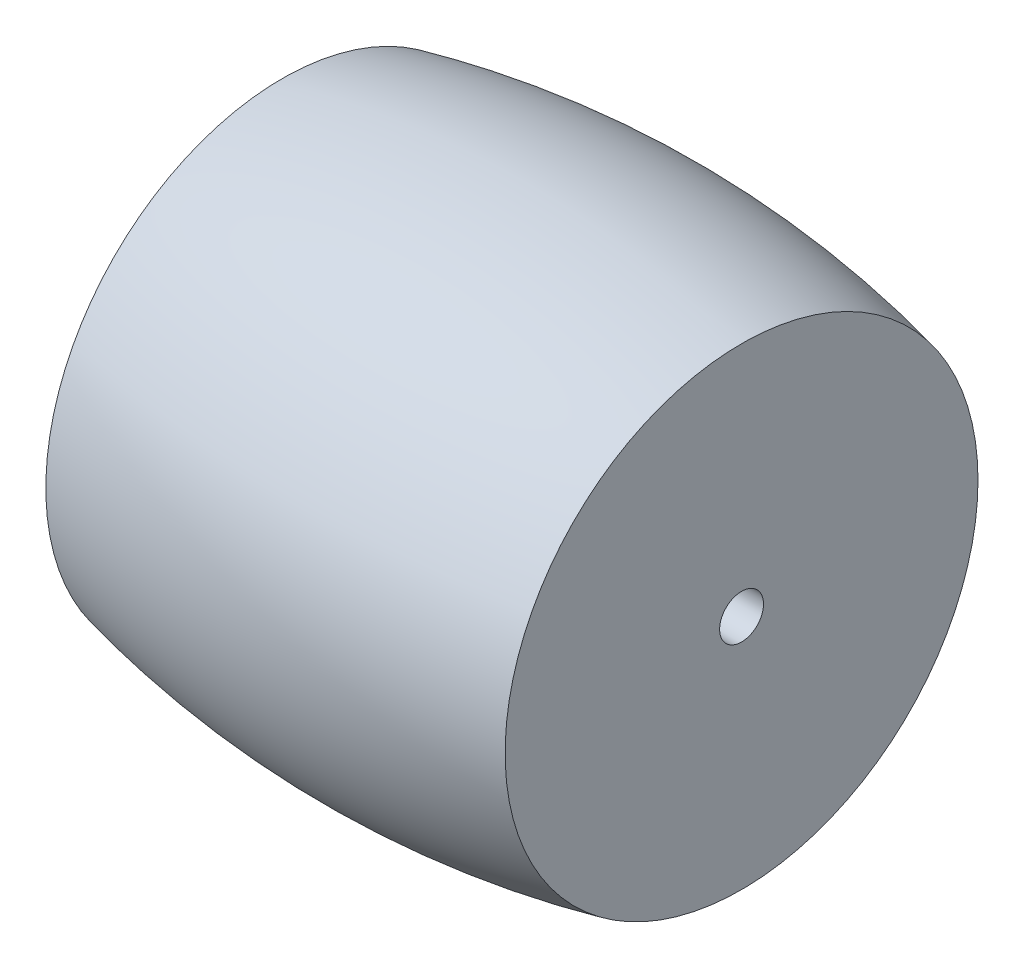
ISO-10303-21;
HEADER;
FILE_DESCRIPTION(('STEP AP214'),'2;1');
FILE_NAME('part.step','',(''),(''),'','','');
FILE_SCHEMA(('AUTOMOTIVE_DESIGN { 1 0 10303 214 1 1 1 1 }'));
ENDSEC;
DATA;
#1=APPLICATION_CONTEXT('core data for automotive mechanical design processes');
#2=APPLICATION_PROTOCOL_DEFINITION('international standard','automotive_design',2000,#1);
#3=PRODUCT_CONTEXT('',#1,'mechanical');
#4=PRODUCT('Part','Part','',(#3));
#5=PRODUCT_RELATED_PRODUCT_CATEGORY('part','',(#4));
#6=PRODUCT_DEFINITION_FORMATION('','',#4);
#7=PRODUCT_DEFINITION_CONTEXT('part definition',#1,'design');
#8=PRODUCT_DEFINITION('design','',#6,#7);
#9=PRODUCT_DEFINITION_SHAPE('','',#8);
#10=(LENGTH_UNIT() NAMED_UNIT(*) SI_UNIT(.MILLI.,.METRE.));
#11=(NAMED_UNIT(*) PLANE_ANGLE_UNIT() SI_UNIT($,.RADIAN.));
#12=(NAMED_UNIT(*) SI_UNIT($,.STERADIAN.) SOLID_ANGLE_UNIT());
#13=UNCERTAINTY_MEASURE_WITH_UNIT(LENGTH_MEASURE(1.E-05),#10,'distance_accuracy_value','');
#14=(GEOMETRIC_REPRESENTATION_CONTEXT(3) GLOBAL_UNCERTAINTY_ASSIGNED_CONTEXT((#13)) GLOBAL_UNIT_ASSIGNED_CONTEXT((#10,
#11,#12)) REPRESENTATION_CONTEXT('',''));
#15=CARTESIAN_POINT('',(0.,0.,0.));
#16=DIRECTION('',(0.,0.,1.));
#17=DIRECTION('',(1.,0.,0.));
#18=AXIS2_PLACEMENT_3D('',#15,#16,#17);
#19=CARTESIAN_POINT('',(-14.6474404776742,1.39999999999999,0.));
#20=DIRECTION('',(-1.,0.,0.));
#21=DIRECTION('',(0.,0.,1.));
#22=AXIS2_PLACEMENT_3D('',#19,#20,#21);
#23=PLANE('',#22);
#24=CARTESIAN_POINT('',(-14.6474404776742,0.,0.));
#25=DIRECTION('',(1.,0.,0.));
#26=DIRECTION('',(0.,0.,-1.));
#27=AXIS2_PLACEMENT_3D('',#24,#25,#26);
#28=CIRCLE('',#27,15.08125);
#29=CARTESIAN_POINT('',(-14.6474404776742,0.,-15.08125));
#30=VERTEX_POINT('',#29);
#31=EDGE_CURVE('E73',#30,#30,#28,.T.);
#32=ORIENTED_EDGE('',*,*,#31,.F.);
#33=EDGE_LOOP('',(#32));
#34=FACE_BOUND('',#33,.T.);
#35=CARTESIAN_POINT('',(-14.6474404776742,0.,0.));
#36=DIRECTION('',(1.,0.,0.));
#37=DIRECTION('',(0.,0.,-1.));
#38=AXIS2_PLACEMENT_3D('',#35,#36,#37);
#39=CIRCLE('',#38,1.39999999999999);
#40=CARTESIAN_POINT('',(-14.6474404776742,0.,-1.39999999999999));
#41=VERTEX_POINT('',#40);
#42=EDGE_CURVE('E71',#41,#41,#39,.T.);
#43=ORIENTED_EDGE('',*,*,#42,.T.);
#44=EDGE_LOOP('',(#43));
#45=FACE_BOUND('',#44,.T.);
#46=ADVANCED_FACE('F36',(#34,#45),#23,.T.);
#47=CARTESIAN_POINT('',(23.6421256724856,0.,0.));
#48=DIRECTION('',(1.,0.,0.));
#49=DIRECTION('',(0.,0.,-1.));
#50=AXIS2_PLACEMENT_3D('',#47,#48,#49);
#51=CYLINDRICAL_SURFACE('',#50,1.39999999999999);
#52=CARTESIAN_POINT('',(14.6474404776742,0.,0.));
#53=DIRECTION('',(1.,0.,0.));
#54=DIRECTION('',(0.,0.,-1.));
#55=AXIS2_PLACEMENT_3D('',#52,#53,#54);
#56=CIRCLE('',#55,1.39999999999999);
#57=CARTESIAN_POINT('',(14.6474404776742,0.,-1.39999999999999));
#58=VERTEX_POINT('',#57);
#59=EDGE_CURVE('E68',#58,#58,#56,.T.);
#60=ORIENTED_EDGE('',*,*,#59,.T.);
#61=EDGE_LOOP('',(#60));
#62=FACE_BOUND('',#61,.T.);
#63=ORIENTED_EDGE('',*,*,#42,.F.);
#64=EDGE_LOOP('',(#63));
#65=FACE_BOUND('',#64,.T.);
#66=ADVANCED_FACE('F142',(#62,#65),#51,.F.);
#67=CARTESIAN_POINT('',(14.6474404776742,1.39999999999999,0.));
#68=DIRECTION('',(1.,0.,0.));
#69=DIRECTION('',(0.,0.,-1.));
#70=AXIS2_PLACEMENT_3D('',#67,#68,#69);
#71=PLANE('',#70);
#72=CARTESIAN_POINT('',(14.6474404776742,0.,0.));
#73=DIRECTION('',(1.,0.,0.));
#74=DIRECTION('',(0.,0.,-1.));
#75=AXIS2_PLACEMENT_3D('',#72,#73,#74);
#76=CIRCLE('',#75,15.08125);
#77=CARTESIAN_POINT('',(14.6474404776742,0.,-15.08125));
#78=VERTEX_POINT('',#77);
#79=EDGE_CURVE('E65',#78,#78,#76,.T.);
#80=ORIENTED_EDGE('',*,*,#79,.T.);
#81=EDGE_LOOP('',(#80));
#82=FACE_BOUND('',#81,.T.);
#83=ORIENTED_EDGE('',*,*,#59,.F.);
#84=EDGE_LOOP('',(#83));
#85=FACE_BOUND('',#84,.T.);
#86=ADVANCED_FACE('F149',(#82,#85),#71,.T.);
#87=CARTESIAN_POINT('',(0.,0.,0.));
#88=DIRECTION('',(1.,0.,0.));
#89=DIRECTION('',(0.,0.,-1.));
#90=AXIS2_PLACEMENT_3D('',#87,#88,#89);
#91=DEGENERATE_TOROIDAL_SURFACE('',#90,49.0933798193686,65.825,.F.);
#92=ORIENTED_EDGE('',*,*,#31,.T.);
#93=EDGE_LOOP('',(#92));
#94=FACE_BOUND('',#93,.T.);
#95=ORIENTED_EDGE('',*,*,#79,.F.);
#96=EDGE_LOOP('',(#95));
#97=FACE_BOUND('',#96,.T.);
#98=ADVANCED_FACE('F154',(#94,#97),#91,.F.);
#99=CLOSED_SHELL('',(#46,#66,#86,#98));
#100=CARTESIAN_POINT('',(0.,0.,0.));
#101=DIRECTION('',(1.,0.,0.));
#102=DIRECTION('',(0.,0.,-1.));
#103=AXIS2_PLACEMENT_3D('',#100,#101,#102);
#104=DEGENERATE_TOROIDAL_SURFACE('',#103,52.0933798193686,65.825,.F.);
#105=CARTESIAN_POINT('',(11.6474404776742,0.,0.));
#106=DIRECTION('',(-1.,0.,0.));
#107=DIRECTION('',(0.,0.,1.));
#108=AXIS2_PLACEMENT_3D('',#105,#106,#107);
#109=CIRCLE('',#108,12.6929440099632);
#110=CARTESIAN_POINT('',(11.6474404776742,0.,12.6929440099632));
#111=VERTEX_POINT('',#110);
#112=EDGE_CURVE('E10',#111,#111,#109,.F.);
#113=ORIENTED_EDGE('',*,*,#112,.T.);
#114=EDGE_LOOP('',(#113));
#115=FACE_BOUND('',#114,.T.);
#116=CARTESIAN_POINT('',(1.5,0.,0.));
#117=DIRECTION('',(1.,0.,0.));
#118=DIRECTION('',(0.,0.,-1.));
#119=AXIS2_PLACEMENT_3D('',#116,#117,#118);
#120=CIRCLE('',#119,13.7145271903518);
#121=CARTESIAN_POINT('',(1.5,0.,-13.7145271903518));
#122=VERTEX_POINT('',#121);
#123=EDGE_CURVE('E44',#122,#122,#120,.F.);
#124=ORIENTED_EDGE('',*,*,#123,.T.);
#125=EDGE_LOOP('',(#124));
#126=FACE_BOUND('',#125,.T.);
#127=ADVANCED_FACE('F100',(#115,#126),#104,.T.);
#128=CARTESIAN_POINT('',(11.6474404776742,3.39999999999999,0.));
#129=DIRECTION('',(-1.,0.,0.));
#130=DIRECTION('',(0.,0.,1.));
#131=AXIS2_PLACEMENT_3D('',#128,#129,#130);
#132=PLANE('',#131);
#133=CARTESIAN_POINT('',(11.6474404776742,0.,0.));
#134=DIRECTION('',(1.,0.,0.));
#135=DIRECTION('',(0.,0.,-1.));
#136=AXIS2_PLACEMENT_3D('',#133,#134,#135);
#137=CIRCLE('',#136,3.39999999999999);
#138=CARTESIAN_POINT('',(11.6474404776742,0.,-3.39999999999999));
#139=VERTEX_POINT('',#138);
#140=EDGE_CURVE('E62',#139,#139,#137,.T.);
#141=ORIENTED_EDGE('',*,*,#140,.T.);
#142=EDGE_LOOP('',(#141));
#143=FACE_BOUND('',#142,.T.);
#144=ORIENTED_EDGE('',*,*,#112,.F.);
#145=EDGE_LOOP('',(#144));
#146=FACE_BOUND('',#145,.T.);
#147=ADVANCED_FACE('F105',(#143,#146),#132,.T.);
#148=CARTESIAN_POINT('',(23.6421256724856,0.,0.));
#149=DIRECTION('',(1.,0.,0.));
#150=DIRECTION('',(0.,0.,-1.));
#151=AXIS2_PLACEMENT_3D('',#148,#149,#150);
#152=CYLINDRICAL_SURFACE('',#151,3.39999999999999);
#153=CARTESIAN_POINT('',(1.5,0.,0.));
#154=DIRECTION('',(1.,0.,0.));
#155=DIRECTION('',(0.,0.,-1.));
#156=AXIS2_PLACEMENT_3D('',#153,#154,#155);
#157=CIRCLE('',#156,3.39999999999999);
#158=CARTESIAN_POINT('',(1.5,0.,-3.39999999999999));
#159=VERTEX_POINT('',#158);
#160=EDGE_CURVE('E59',#159,#159,#157,.T.);
#161=ORIENTED_EDGE('',*,*,#160,.T.);
#162=EDGE_LOOP('',(#161));
#163=FACE_BOUND('',#162,.T.);
#164=ORIENTED_EDGE('',*,*,#140,.F.);
#165=EDGE_LOOP('',(#164));
#166=FACE_BOUND('',#165,.T.);
#167=ADVANCED_FACE('F110',(#163,#166),#152,.T.);
#168=CARTESIAN_POINT('',(1.5,16.7145271903518,0.));
#169=DIRECTION('',(1.,0.,0.));
#170=DIRECTION('',(0.,0.,-1.));
#171=AXIS2_PLACEMENT_3D('',#168,#169,#170);
#172=PLANE('',#171);
#173=ORIENTED_EDGE('',*,*,#160,.F.);
#174=EDGE_LOOP('',(#173));
#175=FACE_BOUND('',#174,.T.);
#176=ORIENTED_EDGE('',*,*,#123,.F.);
#177=EDGE_LOOP('',(#176));
#178=FACE_BOUND('',#177,.T.);
#179=ADVANCED_FACE('F180',(#175,#178),#172,.T.);
#180=CLOSED_SHELL('',(#127,#147,#167,#179));
#181=CARTESIAN_POINT('',(-1.5,0.,0.));
#182=DIRECTION('',(-1.,0.,0.));
#183=DIRECTION('',(0.,0.,1.));
#184=AXIS2_PLACEMENT_3D('',#181,#182,#183);
#185=CIRCLE('',#184,13.7145271903518);
#186=CARTESIAN_POINT('',(-1.5,0.,13.7145271903518));
#187=VERTEX_POINT('',#186);
#188=EDGE_CURVE('E49',#187,#187,#185,.F.);
#189=ORIENTED_EDGE('',*,*,#188,.T.);
#190=EDGE_LOOP('',(#189));
#191=FACE_BOUND('',#190,.T.);
#192=CARTESIAN_POINT('',(-11.6474404776742,0.,0.));
#193=DIRECTION('',(1.,0.,0.));
#194=DIRECTION('',(0.,0.,-1.));
#195=AXIS2_PLACEMENT_3D('',#192,#193,#194);
#196=CIRCLE('',#195,12.6929440099632);
#197=CARTESIAN_POINT('',(-11.6474404776742,0.,-12.6929440099632));
#198=VERTEX_POINT('',#197);
#199=EDGE_CURVE('E39',#198,#198,#196,.F.);
#200=ORIENTED_EDGE('',*,*,#199,.T.);
#201=EDGE_LOOP('',(#200));
#202=FACE_BOUND('',#201,.T.);
#203=ADVANCED_FACE('F83',(#191,#202),#104,.T.);
#204=CARTESIAN_POINT('',(-1.5,3.39999999999999,0.));
#205=DIRECTION('',(-1.,0.,0.));
#206=DIRECTION('',(0.,0.,1.));
#207=AXIS2_PLACEMENT_3D('',#204,#205,#206);
#208=PLANE('',#207);
#209=CARTESIAN_POINT('',(-1.5,0.,0.));
#210=DIRECTION('',(1.,0.,0.));
#211=DIRECTION('',(0.,0.,-1.));
#212=AXIS2_PLACEMENT_3D('',#209,#210,#211);
#213=CIRCLE('',#212,3.39999999999999);
#214=CARTESIAN_POINT('',(-1.5,0.,-3.39999999999999));
#215=VERTEX_POINT('',#214);
#216=EDGE_CURVE('E56',#215,#215,#213,.T.);
#217=ORIENTED_EDGE('',*,*,#216,.T.);
#218=EDGE_LOOP('',(#217));
#219=FACE_BOUND('',#218,.T.);
#220=ORIENTED_EDGE('',*,*,#188,.F.);
#221=EDGE_LOOP('',(#220));
#222=FACE_BOUND('',#221,.T.);
#223=ADVANCED_FACE('F85',(#219,#222),#208,.T.);
#224=CARTESIAN_POINT('',(23.6421256724856,0.,0.));
#225=DIRECTION('',(1.,0.,0.));
#226=DIRECTION('',(0.,0.,-1.));
#227=AXIS2_PLACEMENT_3D('',#224,#225,#226);
#228=CYLINDRICAL_SURFACE('',#227,3.39999999999999);
#229=CARTESIAN_POINT('',(-11.6474404776742,0.,0.));
#230=DIRECTION('',(1.,0.,0.));
#231=DIRECTION('',(0.,0.,-1.));
#232=AXIS2_PLACEMENT_3D('',#229,#230,#231);
#233=CIRCLE('',#232,3.39999999999999);
#234=CARTESIAN_POINT('',(-11.6474404776742,0.,-3.39999999999999));
#235=VERTEX_POINT('',#234);
#236=EDGE_CURVE('E53',#235,#235,#233,.T.);
#237=ORIENTED_EDGE('',*,*,#236,.T.);
#238=EDGE_LOOP('',(#237));
#239=FACE_BOUND('',#238,.T.);
#240=ORIENTED_EDGE('',*,*,#216,.F.);
#241=EDGE_LOOP('',(#240));
#242=FACE_BOUND('',#241,.T.);
#243=ADVANCED_FACE('F87',(#239,#242),#228,.T.);
#244=CARTESIAN_POINT('',(-11.6474404776742,15.6929440099631,0.));
#245=DIRECTION('',(1.,0.,0.));
#246=DIRECTION('',(0.,0.,-1.));
#247=AXIS2_PLACEMENT_3D('',#244,#245,#246);
#248=PLANE('',#247);
#249=ORIENTED_EDGE('',*,*,#236,.F.);
#250=EDGE_LOOP('',(#249));
#251=FACE_BOUND('',#250,.T.);
#252=ORIENTED_EDGE('',*,*,#199,.F.);
#253=EDGE_LOOP('',(#252));
#254=FACE_BOUND('',#253,.T.);
#255=ADVANCED_FACE('F96',(#251,#254),#248,.T.);
#256=CLOSED_SHELL('',(#203,#223,#243,#255));
#257=ORIENTED_CLOSED_SHELL('',*,#180,.T.);
#258=ORIENTED_CLOSED_SHELL('',*,#256,.T.);
#259=BREP_WITH_VOIDS('B2',#99,(#257,#258));
#260=ADVANCED_BREP_SHAPE_REPRESENTATION('',(#18,#259),#14);
#261=SHAPE_DEFINITION_REPRESENTATION(#9,#260);
ENDSEC;
END-ISO-10303-21;
